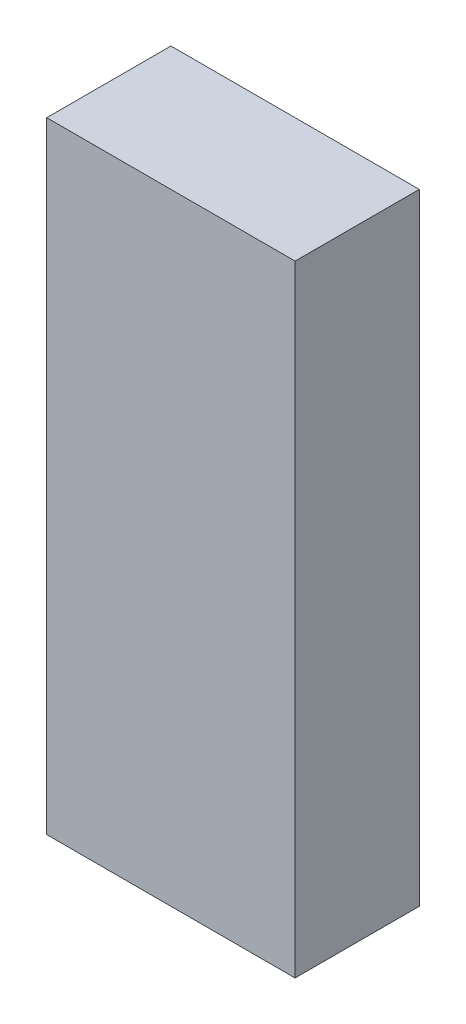
ISO-10303-21;
HEADER;
FILE_DESCRIPTION(('STEP AP214'),'2;1');
FILE_NAME('part.step','',(''),(''),'','','');
FILE_SCHEMA(('AUTOMOTIVE_DESIGN { 1 0 10303 214 1 1 1 1 }'));
ENDSEC;
DATA;
#1=APPLICATION_CONTEXT('core data for automotive mechanical design processes');
#2=APPLICATION_PROTOCOL_DEFINITION('international standard','automotive_design',2000,#1);
#3=PRODUCT_CONTEXT('',#1,'mechanical');
#4=PRODUCT('Part','Part','',(#3));
#5=PRODUCT_RELATED_PRODUCT_CATEGORY('part','',(#4));
#6=PRODUCT_DEFINITION_FORMATION('','',#4);
#7=PRODUCT_DEFINITION_CONTEXT('part definition',#1,'design');
#8=PRODUCT_DEFINITION('design','',#6,#7);
#9=PRODUCT_DEFINITION_SHAPE('','',#8);
#10=(LENGTH_UNIT() NAMED_UNIT(*) SI_UNIT(.MILLI.,.METRE.));
#11=(NAMED_UNIT(*) PLANE_ANGLE_UNIT() SI_UNIT($,.RADIAN.));
#12=(NAMED_UNIT(*) SI_UNIT($,.STERADIAN.) SOLID_ANGLE_UNIT());
#13=UNCERTAINTY_MEASURE_WITH_UNIT(LENGTH_MEASURE(1.E-05),#10,'distance_accuracy_value','');
#14=(GEOMETRIC_REPRESENTATION_CONTEXT(3) GLOBAL_UNCERTAINTY_ASSIGNED_CONTEXT((#13)) GLOBAL_UNIT_ASSIGNED_CONTEXT((#10,
#11,#12)) REPRESENTATION_CONTEXT('',''));
#15=CARTESIAN_POINT('',(0.,0.,0.));
#16=DIRECTION('',(0.,0.,1.));
#17=DIRECTION('',(1.,0.,0.));
#18=AXIS2_PLACEMENT_3D('',#15,#16,#17);
#19=CARTESIAN_POINT('',(-10.,-25.,10.));
#20=DIRECTION('',(1.,0.,0.));
#21=DIRECTION('',(0.,0.,-1.));
#22=AXIS2_PLACEMENT_3D('',#19,#20,#21);
#23=PLANE('',#22);
#24=DIRECTION('',(0.,-1.,0.));
#25=VECTOR('',#24,1.);
#26=CARTESIAN_POINT('',(-10.,-25.,0.));
#27=LINE('',#26,#25);
#28=CARTESIAN_POINT('',(-10.,25.,0.));
#29=VERTEX_POINT('',#28);
#30=CARTESIAN_POINT('',(-10.,-25.,0.));
#31=VERTEX_POINT('',#30);
#32=EDGE_CURVE('E96',#29,#31,#27,.T.);
#33=ORIENTED_EDGE('',*,*,#32,.T.);
#34=DIRECTION('',(0.,0.,-1.));
#35=VECTOR('',#34,1.);
#36=CARTESIAN_POINT('',(-10.,-25.,10.));
#37=LINE('',#36,#35);
#38=CARTESIAN_POINT('',(-10.,-25.,10.));
#39=VERTEX_POINT('',#38);
#40=EDGE_CURVE('E11',#39,#31,#37,.T.);
#41=ORIENTED_EDGE('',*,*,#40,.F.);
#42=DIRECTION('',(0.,-1.,0.));
#43=VECTOR('',#42,1.);
#44=CARTESIAN_POINT('',(-10.,-25.,10.));
#45=LINE('',#44,#43);
#46=CARTESIAN_POINT('',(-10.,25.,10.));
#47=VERTEX_POINT('',#46);
#48=EDGE_CURVE('E84',#47,#39,#45,.T.);
#49=ORIENTED_EDGE('',*,*,#48,.F.);
#50=DIRECTION('',(0.,0.,-1.));
#51=VECTOR('',#50,1.);
#52=CARTESIAN_POINT('',(-10.,25.,10.));
#53=LINE('',#52,#51);
#54=EDGE_CURVE('E92',#47,#29,#53,.T.);
#55=ORIENTED_EDGE('',*,*,#54,.T.);
#56=EDGE_LOOP('',(#33,#41,#49,#55));
#57=FACE_BOUND('',#56,.T.);
#58=ADVANCED_FACE('F33',(#57),#23,.F.);
#59=CARTESIAN_POINT('',(10.,-25.,10.));
#60=DIRECTION('',(0.,1.,0.));
#61=DIRECTION('',(0.,0.,1.));
#62=AXIS2_PLACEMENT_3D('',#59,#60,#61);
#63=PLANE('',#62);
#64=DIRECTION('',(1.,0.,0.));
#65=VECTOR('',#64,1.);
#66=CARTESIAN_POINT('',(10.,-25.,0.));
#67=LINE('',#66,#65);
#68=CARTESIAN_POINT('',(10.,-25.,0.));
#69=VERTEX_POINT('',#68);
#70=EDGE_CURVE('E88',#31,#69,#67,.T.);
#71=ORIENTED_EDGE('',*,*,#70,.T.);
#72=DIRECTION('',(0.,0.,-1.));
#73=VECTOR('',#72,1.);
#74=CARTESIAN_POINT('',(10.,-25.,10.));
#75=LINE('',#74,#73);
#76=CARTESIAN_POINT('',(10.,-25.,10.));
#77=VERTEX_POINT('',#76);
#78=EDGE_CURVE('E41',#77,#69,#75,.T.);
#79=ORIENTED_EDGE('',*,*,#78,.F.);
#80=DIRECTION('',(1.,0.,0.));
#81=VECTOR('',#80,1.);
#82=CARTESIAN_POINT('',(10.,-25.,10.));
#83=LINE('',#82,#81);
#84=EDGE_CURVE('E79',#39,#77,#83,.T.);
#85=ORIENTED_EDGE('',*,*,#84,.F.);
#86=ORIENTED_EDGE('',*,*,#40,.T.);
#87=EDGE_LOOP('',(#71,#79,#85,#86));
#88=FACE_BOUND('',#87,.T.);
#89=ADVANCED_FACE('F87',(#88),#63,.F.);
#90=CARTESIAN_POINT('',(10.,-25.,10.));
#91=DIRECTION('',(-1.,0.,0.));
#92=DIRECTION('',(0.,0.,1.));
#93=AXIS2_PLACEMENT_3D('',#90,#91,#92);
#94=PLANE('',#93);
#95=DIRECTION('',(0.,1.,0.));
#96=VECTOR('',#95,1.);
#97=CARTESIAN_POINT('',(10.,-25.,0.));
#98=LINE('',#97,#96);
#99=CARTESIAN_POINT('',(10.,25.,0.));
#100=VERTEX_POINT('',#99);
#101=EDGE_CURVE('E66',#69,#100,#98,.T.);
#102=ORIENTED_EDGE('',*,*,#101,.T.);
#103=DIRECTION('',(0.,0.,-1.));
#104=VECTOR('',#103,1.);
#105=CARTESIAN_POINT('',(10.,25.,10.));
#106=LINE('',#105,#104);
#107=CARTESIAN_POINT('',(10.,25.,10.));
#108=VERTEX_POINT('',#107);
#109=EDGE_CURVE('E89',#108,#100,#106,.T.);
#110=ORIENTED_EDGE('',*,*,#109,.F.);
#111=DIRECTION('',(0.,1.,0.));
#112=VECTOR('',#111,1.);
#113=CARTESIAN_POINT('',(10.,-25.,10.));
#114=LINE('',#113,#112);
#115=EDGE_CURVE('E82',#77,#108,#114,.T.);
#116=ORIENTED_EDGE('',*,*,#115,.F.);
#117=ORIENTED_EDGE('',*,*,#78,.T.);
#118=EDGE_LOOP('',(#102,#110,#116,#117));
#119=FACE_BOUND('',#118,.T.);
#120=ADVANCED_FACE('F90',(#119),#94,.F.);
#121=CARTESIAN_POINT('',(10.,25.,10.));
#122=DIRECTION('',(0.,-1.,0.));
#123=DIRECTION('',(0.,0.,-1.));
#124=AXIS2_PLACEMENT_3D('',#121,#122,#123);
#125=PLANE('',#124);
#126=DIRECTION('',(-1.,0.,0.));
#127=VECTOR('',#126,1.);
#128=CARTESIAN_POINT('',(10.,25.,0.));
#129=LINE('',#128,#127);
#130=EDGE_CURVE('E72',#100,#29,#129,.T.);
#131=ORIENTED_EDGE('',*,*,#130,.T.);
#132=ORIENTED_EDGE('',*,*,#54,.F.);
#133=DIRECTION('',(-1.,0.,0.));
#134=VECTOR('',#133,1.);
#135=CARTESIAN_POINT('',(10.,25.,10.));
#136=LINE('',#135,#134);
#137=EDGE_CURVE('E49',#108,#47,#136,.T.);
#138=ORIENTED_EDGE('',*,*,#137,.F.);
#139=ORIENTED_EDGE('',*,*,#109,.T.);
#140=EDGE_LOOP('',(#131,#132,#138,#139));
#141=FACE_BOUND('',#140,.T.);
#142=ADVANCED_FACE('F103',(#141),#125,.F.);
#143=CARTESIAN_POINT('',(0.,0.,10.));
#144=DIRECTION('',(0.,0.,1.));
#145=DIRECTION('',(1.,0.,0.));
#146=AXIS2_PLACEMENT_3D('',#143,#144,#145);
#147=PLANE('',#146);
#148=ORIENTED_EDGE('',*,*,#48,.T.);
#149=ORIENTED_EDGE('',*,*,#84,.T.);
#150=ORIENTED_EDGE('',*,*,#115,.T.);
#151=ORIENTED_EDGE('',*,*,#137,.T.);
#152=EDGE_LOOP('',(#148,#149,#150,#151));
#153=FACE_BOUND('',#152,.T.);
#154=ADVANCED_FACE('F80',(#153),#147,.T.);
#155=CARTESIAN_POINT('',(0.,0.,0.));
#156=DIRECTION('',(0.,0.,1.));
#157=DIRECTION('',(1.,0.,0.));
#158=AXIS2_PLACEMENT_3D('',#155,#156,#157);
#159=PLANE('',#158);
#160=ORIENTED_EDGE('',*,*,#32,.F.);
#161=ORIENTED_EDGE('',*,*,#130,.F.);
#162=ORIENTED_EDGE('',*,*,#101,.F.);
#163=ORIENTED_EDGE('',*,*,#70,.F.);
#164=EDGE_LOOP('',(#160,#161,#162,#163));
#165=FACE_BOUND('',#164,.T.);
#166=ADVANCED_FACE('F106',(#165),#159,.F.);
#167=CLOSED_SHELL('',(#58,#89,#120,#142,#154,#166));
#168=MANIFOLD_SOLID_BREP('B2',#167);
#169=ADVANCED_BREP_SHAPE_REPRESENTATION('',(#18,#168),#14);
#170=SHAPE_DEFINITION_REPRESENTATION(#9,#169);
ENDSEC;
END-ISO-10303-21;
